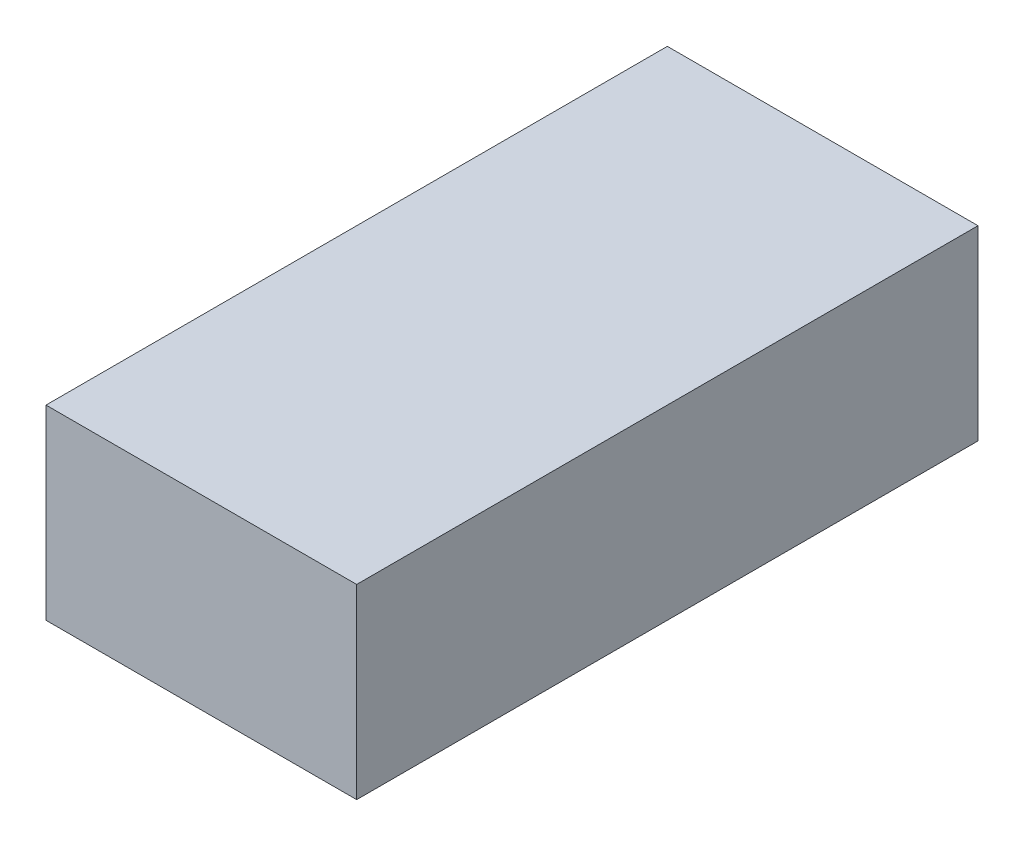
ISO-10303-21;
HEADER;
FILE_DESCRIPTION(('STEP AP214'),'2;1');
FILE_NAME('part.step','',(''),(''),'','','');
FILE_SCHEMA(('AUTOMOTIVE_DESIGN { 1 0 10303 214 1 1 1 1 }'));
ENDSEC;
DATA;
#1=APPLICATION_CONTEXT('core data for automotive mechanical design processes');
#2=APPLICATION_PROTOCOL_DEFINITION('international standard','automotive_design',2000,#1);
#3=PRODUCT_CONTEXT('',#1,'mechanical');
#4=PRODUCT('Part','Part','',(#3));
#5=PRODUCT_RELATED_PRODUCT_CATEGORY('part','',(#4));
#6=PRODUCT_DEFINITION_FORMATION('','',#4);
#7=PRODUCT_DEFINITION_CONTEXT('part definition',#1,'design');
#8=PRODUCT_DEFINITION('design','',#6,#7);
#9=PRODUCT_DEFINITION_SHAPE('','',#8);
#10=(LENGTH_UNIT() NAMED_UNIT(*) SI_UNIT(.MILLI.,.METRE.));
#11=(NAMED_UNIT(*) PLANE_ANGLE_UNIT() SI_UNIT($,.RADIAN.));
#12=(NAMED_UNIT(*) SI_UNIT($,.STERADIAN.) SOLID_ANGLE_UNIT());
#13=UNCERTAINTY_MEASURE_WITH_UNIT(LENGTH_MEASURE(1.E-05),#10,'distance_accuracy_value','');
#14=(GEOMETRIC_REPRESENTATION_CONTEXT(3) GLOBAL_UNCERTAINTY_ASSIGNED_CONTEXT((#13)) GLOBAL_UNIT_ASSIGNED_CONTEXT((#10,
#11,#12)) REPRESENTATION_CONTEXT('',''));
#15=CARTESIAN_POINT('',(0.,0.,0.));
#16=DIRECTION('',(0.,0.,1.));
#17=DIRECTION('',(1.,0.,0.));
#18=AXIS2_PLACEMENT_3D('',#15,#16,#17);
#19=CARTESIAN_POINT('',(12.5,7.5,50.));
#20=DIRECTION('',(-1.,0.,0.));
#21=DIRECTION('',(0.,-1.,0.));
#22=AXIS2_PLACEMENT_3D('',#19,#20,#21);
#23=PLANE('',#22);
#24=DIRECTION('',(0.,1.,0.));
#25=VECTOR('',#24,1.);
#26=CARTESIAN_POINT('',(12.5,7.5,0.));
#27=LINE('',#26,#25);
#28=CARTESIAN_POINT('',(12.5,-7.5,0.));
#29=VERTEX_POINT('',#28);
#30=CARTESIAN_POINT('',(12.5,7.5,0.));
#31=VERTEX_POINT('',#30);
#32=EDGE_CURVE('E102',#29,#31,#27,.T.);
#33=ORIENTED_EDGE('',*,*,#32,.T.);
#34=DIRECTION('',(0.,0.,-1.));
#35=VECTOR('',#34,1.);
#36=CARTESIAN_POINT('',(12.5,7.5,50.));
#37=LINE('',#36,#35);
#38=CARTESIAN_POINT('',(12.5,7.5,50.));
#39=VERTEX_POINT('',#38);
#40=EDGE_CURVE('E11',#39,#31,#37,.T.);
#41=ORIENTED_EDGE('',*,*,#40,.F.);
#42=DIRECTION('',(0.,1.,0.));
#43=VECTOR('',#42,1.);
#44=CARTESIAN_POINT('',(12.5,7.5,50.));
#45=LINE('',#44,#43);
#46=CARTESIAN_POINT('',(12.5,-7.5,50.));
#47=VERTEX_POINT('',#46);
#48=EDGE_CURVE('E90',#47,#39,#45,.T.);
#49=ORIENTED_EDGE('',*,*,#48,.F.);
#50=DIRECTION('',(0.,0.,-1.));
#51=VECTOR('',#50,1.);
#52=CARTESIAN_POINT('',(12.5,-7.5,50.));
#53=LINE('',#52,#51);
#54=EDGE_CURVE('E98',#47,#29,#53,.T.);
#55=ORIENTED_EDGE('',*,*,#54,.T.);
#56=EDGE_LOOP('',(#33,#41,#49,#55));
#57=FACE_BOUND('',#56,.T.);
#58=ADVANCED_FACE('F39',(#57),#23,.F.);
#59=CARTESIAN_POINT('',(-12.5,7.5,50.));
#60=DIRECTION('',(0.,-1.,0.));
#61=DIRECTION('',(0.,0.,-1.));
#62=AXIS2_PLACEMENT_3D('',#59,#60,#61);
#63=PLANE('',#62);
#64=DIRECTION('',(-1.,0.,0.));
#65=VECTOR('',#64,1.);
#66=CARTESIAN_POINT('',(-12.5,7.5,0.));
#67=LINE('',#66,#65);
#68=CARTESIAN_POINT('',(-12.5,7.5,0.));
#69=VERTEX_POINT('',#68);
#70=EDGE_CURVE('E94',#31,#69,#67,.T.);
#71=ORIENTED_EDGE('',*,*,#70,.T.);
#72=DIRECTION('',(0.,0.,-1.));
#73=VECTOR('',#72,1.);
#74=CARTESIAN_POINT('',(-12.5,7.5,50.));
#75=LINE('',#74,#73);
#76=CARTESIAN_POINT('',(-12.5,7.5,50.));
#77=VERTEX_POINT('',#76);
#78=EDGE_CURVE('E47',#77,#69,#75,.T.);
#79=ORIENTED_EDGE('',*,*,#78,.F.);
#80=DIRECTION('',(-1.,0.,0.));
#81=VECTOR('',#80,1.);
#82=CARTESIAN_POINT('',(-12.5,7.5,50.));
#83=LINE('',#82,#81);
#84=EDGE_CURVE('E85',#39,#77,#83,.T.);
#85=ORIENTED_EDGE('',*,*,#84,.F.);
#86=ORIENTED_EDGE('',*,*,#40,.T.);
#87=EDGE_LOOP('',(#71,#79,#85,#86));
#88=FACE_BOUND('',#87,.T.);
#89=ADVANCED_FACE('F93',(#88),#63,.F.);
#90=CARTESIAN_POINT('',(-12.5,7.5,50.));
#91=DIRECTION('',(1.,0.,0.));
#92=DIRECTION('',(0.,1.,0.));
#93=AXIS2_PLACEMENT_3D('',#90,#91,#92);
#94=PLANE('',#93);
#95=DIRECTION('',(0.,-1.,0.));
#96=VECTOR('',#95,1.);
#97=CARTESIAN_POINT('',(-12.5,7.5,0.));
#98=LINE('',#97,#96);
#99=CARTESIAN_POINT('',(-12.5,-7.5,0.));
#100=VERTEX_POINT('',#99);
#101=EDGE_CURVE('E72',#69,#100,#98,.T.);
#102=ORIENTED_EDGE('',*,*,#101,.T.);
#103=DIRECTION('',(0.,0.,-1.));
#104=VECTOR('',#103,1.);
#105=CARTESIAN_POINT('',(-12.5,-7.5,50.));
#106=LINE('',#105,#104);
#107=CARTESIAN_POINT('',(-12.5,-7.5,50.));
#108=VERTEX_POINT('',#107);
#109=EDGE_CURVE('E95',#108,#100,#106,.T.);
#110=ORIENTED_EDGE('',*,*,#109,.F.);
#111=DIRECTION('',(0.,-1.,0.));
#112=VECTOR('',#111,1.);
#113=CARTESIAN_POINT('',(-12.5,7.5,50.));
#114=LINE('',#113,#112);
#115=EDGE_CURVE('E88',#77,#108,#114,.T.);
#116=ORIENTED_EDGE('',*,*,#115,.F.);
#117=ORIENTED_EDGE('',*,*,#78,.T.);
#118=EDGE_LOOP('',(#102,#110,#116,#117));
#119=FACE_BOUND('',#118,.T.);
#120=ADVANCED_FACE('F96',(#119),#94,.F.);
#121=CARTESIAN_POINT('',(-12.5,-7.5,50.));
#122=DIRECTION('',(0.,1.,0.));
#123=DIRECTION('',(0.,0.,1.));
#124=AXIS2_PLACEMENT_3D('',#121,#122,#123);
#125=PLANE('',#124);
#126=DIRECTION('',(1.,0.,0.));
#127=VECTOR('',#126,1.);
#128=CARTESIAN_POINT('',(-12.5,-7.5,0.));
#129=LINE('',#128,#127);
#130=EDGE_CURVE('E78',#100,#29,#129,.T.);
#131=ORIENTED_EDGE('',*,*,#130,.T.);
#132=ORIENTED_EDGE('',*,*,#54,.F.);
#133=DIRECTION('',(1.,0.,0.));
#134=VECTOR('',#133,1.);
#135=CARTESIAN_POINT('',(-12.5,-7.5,50.));
#136=LINE('',#135,#134);
#137=EDGE_CURVE('E55',#108,#47,#136,.T.);
#138=ORIENTED_EDGE('',*,*,#137,.F.);
#139=ORIENTED_EDGE('',*,*,#109,.T.);
#140=EDGE_LOOP('',(#131,#132,#138,#139));
#141=FACE_BOUND('',#140,.T.);
#142=ADVANCED_FACE('F109',(#141),#125,.F.);
#143=CARTESIAN_POINT('',(0.,0.,50.));
#144=DIRECTION('',(0.,0.,1.));
#145=DIRECTION('',(1.,0.,0.));
#146=AXIS2_PLACEMENT_3D('',#143,#144,#145);
#147=PLANE('',#146);
#148=ORIENTED_EDGE('',*,*,#48,.T.);
#149=ORIENTED_EDGE('',*,*,#84,.T.);
#150=ORIENTED_EDGE('',*,*,#115,.T.);
#151=ORIENTED_EDGE('',*,*,#137,.T.);
#152=EDGE_LOOP('',(#148,#149,#150,#151));
#153=FACE_BOUND('',#152,.T.);
#154=ADVANCED_FACE('F86',(#153),#147,.T.);
#155=CARTESIAN_POINT('',(0.,0.,0.));
#156=DIRECTION('',(0.,0.,1.));
#157=DIRECTION('',(1.,0.,0.));
#158=AXIS2_PLACEMENT_3D('',#155,#156,#157);
#159=PLANE('',#158);
#160=ORIENTED_EDGE('',*,*,#32,.F.);
#161=ORIENTED_EDGE('',*,*,#130,.F.);
#162=ORIENTED_EDGE('',*,*,#101,.F.);
#163=ORIENTED_EDGE('',*,*,#70,.F.);
#164=EDGE_LOOP('',(#160,#161,#162,#163));
#165=FACE_BOUND('',#164,.T.);
#166=ADVANCED_FACE('F112',(#165),#159,.F.);
#167=CLOSED_SHELL('',(#58,#89,#120,#142,#154,#166));
#168=MANIFOLD_SOLID_BREP('B2',#167);
#169=ADVANCED_BREP_SHAPE_REPRESENTATION('',(#18,#168),#14);
#170=SHAPE_DEFINITION_REPRESENTATION(#9,#169);
ENDSEC;
END-ISO-10303-21;
